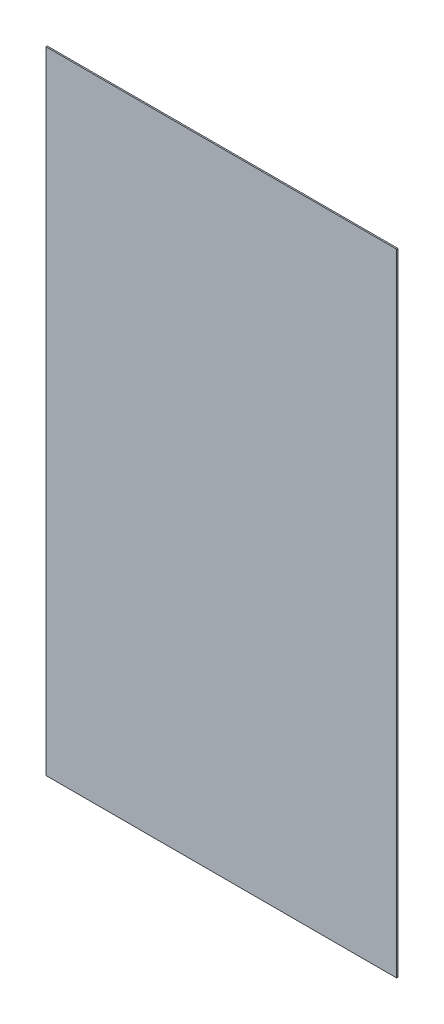
ISO-10303-21;
HEADER;
FILE_DESCRIPTION(('STEP AP214'),'2;1');
FILE_NAME('part.step','',(''),(''),'','','');
FILE_SCHEMA(('AUTOMOTIVE_DESIGN { 1 0 10303 214 1 1 1 1 }'));
ENDSEC;
DATA;
#1=APPLICATION_CONTEXT('core data for automotive mechanical design processes');
#2=APPLICATION_PROTOCOL_DEFINITION('international standard','automotive_design',2000,#1);
#3=PRODUCT_CONTEXT('',#1,'mechanical');
#4=PRODUCT('Part','Part','',(#3));
#5=PRODUCT_RELATED_PRODUCT_CATEGORY('part','',(#4));
#6=PRODUCT_DEFINITION_FORMATION('','',#4);
#7=PRODUCT_DEFINITION_CONTEXT('part definition',#1,'design');
#8=PRODUCT_DEFINITION('design','',#6,#7);
#9=PRODUCT_DEFINITION_SHAPE('','',#8);
#10=(LENGTH_UNIT() NAMED_UNIT(*) SI_UNIT(.MILLI.,.METRE.));
#11=(NAMED_UNIT(*) PLANE_ANGLE_UNIT() SI_UNIT($,.RADIAN.));
#12=(NAMED_UNIT(*) SI_UNIT($,.STERADIAN.) SOLID_ANGLE_UNIT());
#13=UNCERTAINTY_MEASURE_WITH_UNIT(LENGTH_MEASURE(1.E-05),#10,'distance_accuracy_value','');
#14=(GEOMETRIC_REPRESENTATION_CONTEXT(3) GLOBAL_UNCERTAINTY_ASSIGNED_CONTEXT((#13)) GLOBAL_UNIT_ASSIGNED_CONTEXT((#10,
#11,#12)) REPRESENTATION_CONTEXT('',''));
#15=CARTESIAN_POINT('',(0.,0.,0.));
#16=DIRECTION('',(0.,0.,1.));
#17=DIRECTION('',(1.,0.,0.));
#18=AXIS2_PLACEMENT_3D('',#15,#16,#17);
#19=CARTESIAN_POINT('',(250.,450.,1.9));
#20=DIRECTION('',(-1.,0.,0.));
#21=DIRECTION('',(0.,-1.,0.));
#22=AXIS2_PLACEMENT_3D('',#19,#20,#21);
#23=PLANE('',#22);
#24=DIRECTION('',(0.,1.,0.));
#25=VECTOR('',#24,1.);
#26=CARTESIAN_POINT('',(250.,450.,0.));
#27=LINE('',#26,#25);
#28=CARTESIAN_POINT('',(250.,-450.,0.));
#29=VERTEX_POINT('',#28);
#30=CARTESIAN_POINT('',(250.,450.,0.));
#31=VERTEX_POINT('',#30);
#32=EDGE_CURVE('E100',#29,#31,#27,.T.);
#33=ORIENTED_EDGE('',*,*,#32,.T.);
#34=DIRECTION('',(0.,0.,-1.));
#35=VECTOR('',#34,1.);
#36=CARTESIAN_POINT('',(250.,450.,1.9));
#37=LINE('',#36,#35);
#38=CARTESIAN_POINT('',(250.,450.,1.9));
#39=VERTEX_POINT('',#38);
#40=EDGE_CURVE('E11',#39,#31,#37,.T.);
#41=ORIENTED_EDGE('',*,*,#40,.F.);
#42=DIRECTION('',(0.,1.,0.));
#43=VECTOR('',#42,1.);
#44=CARTESIAN_POINT('',(250.,450.,1.9));
#45=LINE('',#44,#43);
#46=CARTESIAN_POINT('',(250.,-450.,1.9));
#47=VERTEX_POINT('',#46);
#48=EDGE_CURVE('E88',#47,#39,#45,.T.);
#49=ORIENTED_EDGE('',*,*,#48,.F.);
#50=DIRECTION('',(0.,0.,-1.));
#51=VECTOR('',#50,1.);
#52=CARTESIAN_POINT('',(250.,-450.,1.9));
#53=LINE('',#52,#51);
#54=EDGE_CURVE('E96',#47,#29,#53,.T.);
#55=ORIENTED_EDGE('',*,*,#54,.T.);
#56=EDGE_LOOP('',(#33,#41,#49,#55));
#57=FACE_BOUND('',#56,.T.);
#58=ADVANCED_FACE('F37',(#57),#23,.F.);
#59=CARTESIAN_POINT('',(-250.,450.,1.9));
#60=DIRECTION('',(0.,-1.,0.));
#61=DIRECTION('',(0.,0.,-1.));
#62=AXIS2_PLACEMENT_3D('',#59,#60,#61);
#63=PLANE('',#62);
#64=DIRECTION('',(-1.,0.,0.));
#65=VECTOR('',#64,1.);
#66=CARTESIAN_POINT('',(-250.,450.,0.));
#67=LINE('',#66,#65);
#68=CARTESIAN_POINT('',(-250.,450.,0.));
#69=VERTEX_POINT('',#68);
#70=EDGE_CURVE('E92',#31,#69,#67,.T.);
#71=ORIENTED_EDGE('',*,*,#70,.T.);
#72=DIRECTION('',(0.,0.,-1.));
#73=VECTOR('',#72,1.);
#74=CARTESIAN_POINT('',(-250.,450.,1.9));
#75=LINE('',#74,#73);
#76=CARTESIAN_POINT('',(-250.,450.,1.9));
#77=VERTEX_POINT('',#76);
#78=EDGE_CURVE('E45',#77,#69,#75,.T.);
#79=ORIENTED_EDGE('',*,*,#78,.F.);
#80=DIRECTION('',(-1.,0.,0.));
#81=VECTOR('',#80,1.);
#82=CARTESIAN_POINT('',(-250.,450.,1.9));
#83=LINE('',#82,#81);
#84=EDGE_CURVE('E83',#39,#77,#83,.T.);
#85=ORIENTED_EDGE('',*,*,#84,.F.);
#86=ORIENTED_EDGE('',*,*,#40,.T.);
#87=EDGE_LOOP('',(#71,#79,#85,#86));
#88=FACE_BOUND('',#87,.T.);
#89=ADVANCED_FACE('F91',(#88),#63,.F.);
#90=CARTESIAN_POINT('',(-250.,450.,1.9));
#91=DIRECTION('',(1.,0.,0.));
#92=DIRECTION('',(0.,1.,0.));
#93=AXIS2_PLACEMENT_3D('',#90,#91,#92);
#94=PLANE('',#93);
#95=DIRECTION('',(0.,-1.,0.));
#96=VECTOR('',#95,1.);
#97=CARTESIAN_POINT('',(-250.,450.,0.));
#98=LINE('',#97,#96);
#99=CARTESIAN_POINT('',(-250.,-450.,0.));
#100=VERTEX_POINT('',#99);
#101=EDGE_CURVE('E70',#69,#100,#98,.T.);
#102=ORIENTED_EDGE('',*,*,#101,.T.);
#103=DIRECTION('',(0.,0.,-1.));
#104=VECTOR('',#103,1.);
#105=CARTESIAN_POINT('',(-250.,-450.,1.9));
#106=LINE('',#105,#104);
#107=CARTESIAN_POINT('',(-250.,-450.,1.9));
#108=VERTEX_POINT('',#107);
#109=EDGE_CURVE('E93',#108,#100,#106,.T.);
#110=ORIENTED_EDGE('',*,*,#109,.F.);
#111=DIRECTION('',(0.,-1.,0.));
#112=VECTOR('',#111,1.);
#113=CARTESIAN_POINT('',(-250.,450.,1.9));
#114=LINE('',#113,#112);
#115=EDGE_CURVE('E86',#77,#108,#114,.T.);
#116=ORIENTED_EDGE('',*,*,#115,.F.);
#117=ORIENTED_EDGE('',*,*,#78,.T.);
#118=EDGE_LOOP('',(#102,#110,#116,#117));
#119=FACE_BOUND('',#118,.T.);
#120=ADVANCED_FACE('F94',(#119),#94,.F.);
#121=CARTESIAN_POINT('',(-250.,-450.,1.9));
#122=DIRECTION('',(0.,1.,0.));
#123=DIRECTION('',(0.,0.,1.));
#124=AXIS2_PLACEMENT_3D('',#121,#122,#123);
#125=PLANE('',#124);
#126=DIRECTION('',(1.,0.,0.));
#127=VECTOR('',#126,1.);
#128=CARTESIAN_POINT('',(-250.,-450.,0.));
#129=LINE('',#128,#127);
#130=EDGE_CURVE('E76',#100,#29,#129,.T.);
#131=ORIENTED_EDGE('',*,*,#130,.T.);
#132=ORIENTED_EDGE('',*,*,#54,.F.);
#133=DIRECTION('',(1.,0.,0.));
#134=VECTOR('',#133,1.);
#135=CARTESIAN_POINT('',(-250.,-450.,1.9));
#136=LINE('',#135,#134);
#137=EDGE_CURVE('E53',#108,#47,#136,.T.);
#138=ORIENTED_EDGE('',*,*,#137,.F.);
#139=ORIENTED_EDGE('',*,*,#109,.T.);
#140=EDGE_LOOP('',(#131,#132,#138,#139));
#141=FACE_BOUND('',#140,.T.);
#142=ADVANCED_FACE('F107',(#141),#125,.F.);
#143=CARTESIAN_POINT('',(0.,0.,1.9));
#144=DIRECTION('',(0.,0.,1.));
#145=DIRECTION('',(1.,0.,0.));
#146=AXIS2_PLACEMENT_3D('',#143,#144,#145);
#147=PLANE('',#146);
#148=ORIENTED_EDGE('',*,*,#48,.T.);
#149=ORIENTED_EDGE('',*,*,#84,.T.);
#150=ORIENTED_EDGE('',*,*,#115,.T.);
#151=ORIENTED_EDGE('',*,*,#137,.T.);
#152=EDGE_LOOP('',(#148,#149,#150,#151));
#153=FACE_BOUND('',#152,.T.);
#154=ADVANCED_FACE('F84',(#153),#147,.T.);
#155=CARTESIAN_POINT('',(0.,0.,0.));
#156=DIRECTION('',(0.,0.,1.));
#157=DIRECTION('',(1.,0.,0.));
#158=AXIS2_PLACEMENT_3D('',#155,#156,#157);
#159=PLANE('',#158);
#160=ORIENTED_EDGE('',*,*,#32,.F.);
#161=ORIENTED_EDGE('',*,*,#130,.F.);
#162=ORIENTED_EDGE('',*,*,#101,.F.);
#163=ORIENTED_EDGE('',*,*,#70,.F.);
#164=EDGE_LOOP('',(#160,#161,#162,#163));
#165=FACE_BOUND('',#164,.T.);
#166=ADVANCED_FACE('F110',(#165),#159,.F.);
#167=CLOSED_SHELL('',(#58,#89,#120,#142,#154,#166));
#168=MANIFOLD_SOLID_BREP('B2',#167);
#169=ADVANCED_BREP_SHAPE_REPRESENTATION('',(#18,#168),#14);
#170=SHAPE_DEFINITION_REPRESENTATION(#9,#169);
ENDSEC;
END-ISO-10303-21;
